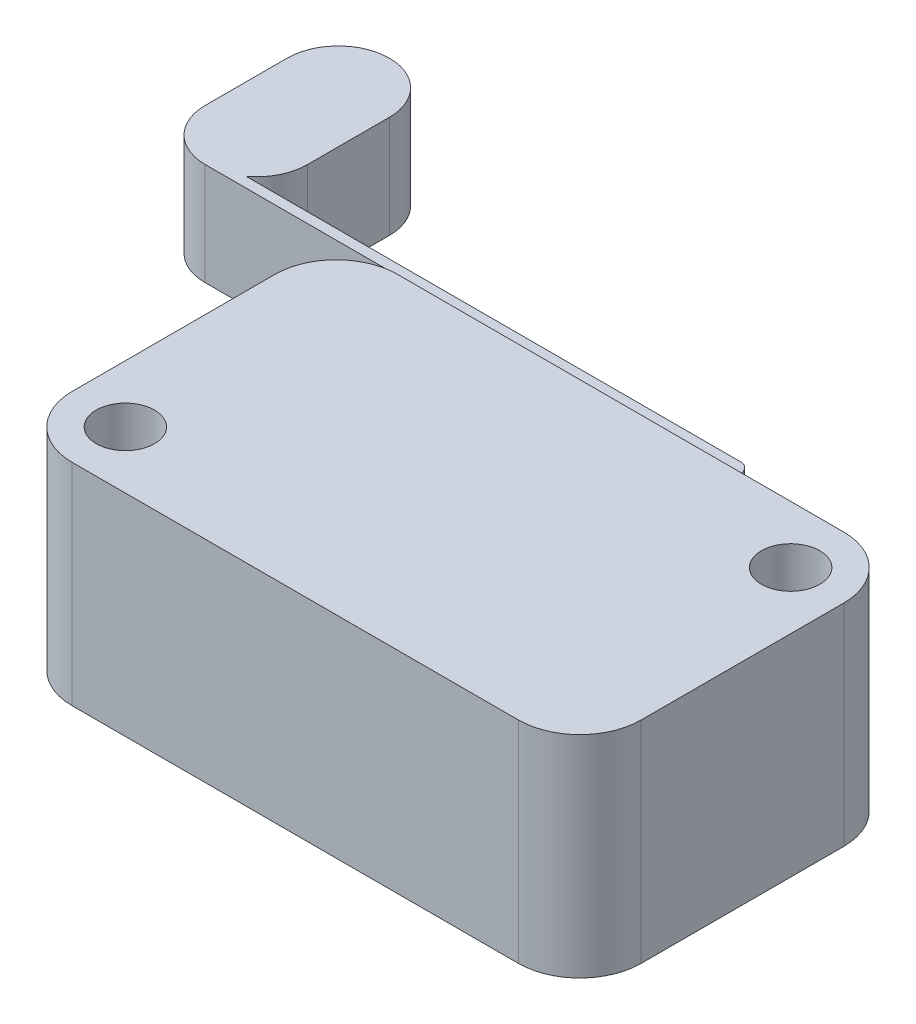
ISO-10303-21;
HEADER;
FILE_DESCRIPTION(('STEP AP214'),'2;1');
FILE_NAME('part.step','',(''),(''),'','','');
FILE_SCHEMA(('AUTOMOTIVE_DESIGN { 1 0 10303 214 1 1 1 1 }'));
ENDSEC;
DATA;
#1=APPLICATION_CONTEXT('core data for automotive mechanical design processes');
#2=APPLICATION_PROTOCOL_DEFINITION('international standard','automotive_design',2000,#1);
#3=PRODUCT_CONTEXT('',#1,'mechanical');
#4=PRODUCT('Part','Part','',(#3));
#5=PRODUCT_RELATED_PRODUCT_CATEGORY('part','',(#4));
#6=PRODUCT_DEFINITION_FORMATION('','',#4);
#7=PRODUCT_DEFINITION_CONTEXT('part definition',#1,'design');
#8=PRODUCT_DEFINITION('design','',#6,#7);
#9=PRODUCT_DEFINITION_SHAPE('','',#8);
#10=(LENGTH_UNIT() NAMED_UNIT(*) SI_UNIT(.MILLI.,.METRE.));
#11=(NAMED_UNIT(*) PLANE_ANGLE_UNIT() SI_UNIT($,.RADIAN.));
#12=(NAMED_UNIT(*) SI_UNIT($,.STERADIAN.) SOLID_ANGLE_UNIT());
#13=UNCERTAINTY_MEASURE_WITH_UNIT(LENGTH_MEASURE(1.E-05),#10,'distance_accuracy_value','');
#14=(GEOMETRIC_REPRESENTATION_CONTEXT(3) GLOBAL_UNCERTAINTY_ASSIGNED_CONTEXT((#13)) GLOBAL_UNIT_ASSIGNED_CONTEXT((#10,
#11,#12)) REPRESENTATION_CONTEXT('',''));
#15=CARTESIAN_POINT('',(0.,0.,0.));
#16=DIRECTION('',(0.,0.,1.));
#17=DIRECTION('',(1.,0.,0.));
#18=AXIS2_PLACEMENT_3D('',#15,#16,#17);
#19=CARTESIAN_POINT('',(0.,5.15,-2.8));
#20=DIRECTION('',(0.,0.,-1.));
#21=DIRECTION('',(-1.,0.,0.));
#22=AXIS2_PLACEMENT_3D('',#19,#20,#21);
#23=PLANE('',#22);
#24=DIRECTION('',(1.,0.,0.));
#25=VECTOR('',#24,1.);
#26=CARTESIAN_POINT('',(0.,2.5,-2.8));
#27=LINE('',#26,#25);
#28=CARTESIAN_POINT('',(-8.35,2.5,-2.8));
#29=VERTEX_POINT('',#28);
#30=CARTESIAN_POINT('',(-7.85,2.5,-2.8));
#31=VERTEX_POINT('',#30);
#32=EDGE_CURVE('E308',#29,#31,#27,.T.);
#33=ORIENTED_EDGE('',*,*,#32,.F.);
#34=DIRECTION('',(0.,-1.,0.));
#35=VECTOR('',#34,1.);
#36=CARTESIAN_POINT('',(-8.35,2.5,-2.8));
#37=LINE('',#36,#35);
#38=CARTESIAN_POINT('',(-8.35,-2.5,-2.8));
#39=VERTEX_POINT('',#38);
#40=EDGE_CURVE('E306',#29,#39,#37,.T.);
#41=ORIENTED_EDGE('',*,*,#40,.T.);
#42=DIRECTION('',(1.,0.,0.));
#43=VECTOR('',#42,1.);
#44=CARTESIAN_POINT('',(0.,-2.5,-2.8));
#45=LINE('',#44,#43);
#46=CARTESIAN_POINT('',(-7.85,-2.5,-2.8));
#47=VERTEX_POINT('',#46);
#48=EDGE_CURVE('E330',#39,#47,#45,.T.);
#49=ORIENTED_EDGE('',*,*,#48,.T.);
#50=DIRECTION('',(0.,-1.,0.));
#51=VECTOR('',#50,1.);
#52=CARTESIAN_POINT('',(-7.85,2.5,-2.8));
#53=LINE('',#52,#51);
#54=EDGE_CURVE('E317',#31,#47,#53,.T.);
#55=ORIENTED_EDGE('',*,*,#54,.F.);
#56=EDGE_LOOP('',(#33,#41,#49,#55));
#57=FACE_BOUND('',#56,.T.);
#58=DIRECTION('',(1.,0.,0.));
#59=VECTOR('',#58,1.);
#60=CARTESIAN_POINT('',(0.,5.15,-2.8));
#61=LINE('',#60,#59);
#62=CARTESIAN_POINT('',(-22.,5.15,-2.8));
#63=VERTEX_POINT('',#62);
#64=CARTESIAN_POINT('',(-0.199999999999996,5.15,-2.8));
#65=VERTEX_POINT('',#64);
#66=EDGE_CURVE('E215',#63,#65,#61,.T.);
#67=ORIENTED_EDGE('',*,*,#66,.T.);
#68=DIRECTION('',(0.,-1.,0.));
#69=VECTOR('',#68,1.);
#70=CARTESIAN_POINT('',(-0.199999999999996,5.15,-2.8));
#71=LINE('',#70,#69);
#72=CARTESIAN_POINT('',(-0.199999999999996,-5.15,-2.8));
#73=VERTEX_POINT('',#72);
#74=EDGE_CURVE('E242',#65,#73,#71,.T.);
#75=ORIENTED_EDGE('',*,*,#74,.T.);
#76=DIRECTION('',(1.,0.,0.));
#77=VECTOR('',#76,1.);
#78=CARTESIAN_POINT('',(0.,-5.15,-2.8));
#79=LINE('',#78,#77);
#80=CARTESIAN_POINT('',(-22.,-5.15,-2.8));
#81=VERTEX_POINT('',#80);
#82=EDGE_CURVE('E230',#81,#73,#79,.T.);
#83=ORIENTED_EDGE('',*,*,#82,.F.);
#84=DIRECTION('',(0.,-1.,0.));
#85=VECTOR('',#84,1.);
#86=CARTESIAN_POINT('',(-22.,5.15,-2.8));
#87=LINE('',#86,#85);
#88=EDGE_CURVE('E226',#81,#63,#87,.F.);
#89=ORIENTED_EDGE('',*,*,#88,.T.);
#90=EDGE_LOOP('',(#67,#75,#83,#89));
#91=FACE_BOUND('',#90,.T.);
#92=ADVANCED_FACE('F36',(#57,#91),#23,.T.);
#93=CARTESIAN_POINT('',(-25.,5.15,0.));
#94=DIRECTION('',(1.,0.,0.));
#95=DIRECTION('',(0.,0.,-1.));
#96=AXIS2_PLACEMENT_3D('',#93,#94,#95);
#97=PLANE('',#96);
#98=DIRECTION('',(0.,0.,1.));
#99=VECTOR('',#98,1.);
#100=CARTESIAN_POINT('',(-25.,5.15,0.));
#101=LINE('',#100,#99);
#102=CARTESIAN_POINT('',(-25.,5.15,0.200000000000001));
#103=VERTEX_POINT('',#102);
#104=CARTESIAN_POINT('',(-25.,5.15,10.1));
#105=VERTEX_POINT('',#104);
#106=EDGE_CURVE('E218',#103,#105,#101,.T.);
#107=ORIENTED_EDGE('',*,*,#106,.F.);
#108=DIRECTION('',(0.,-1.,0.));
#109=VECTOR('',#108,1.);
#110=CARTESIAN_POINT('',(-25.,-5.15,0.200000000000001));
#111=LINE('',#110,#109);
#112=CARTESIAN_POINT('',(-25.,-5.15,0.200000000000001));
#113=VERTEX_POINT('',#112);
#114=EDGE_CURVE('E273',#103,#113,#111,.T.);
#115=ORIENTED_EDGE('',*,*,#114,.T.);
#116=DIRECTION('',(0.,0.,1.));
#117=VECTOR('',#116,1.);
#118=CARTESIAN_POINT('',(-25.,-5.15,0.));
#119=LINE('',#118,#117);
#120=CARTESIAN_POINT('',(-25.,-5.15,10.1));
#121=VERTEX_POINT('',#120);
#122=EDGE_CURVE('E233',#113,#121,#119,.T.);
#123=ORIENTED_EDGE('',*,*,#122,.T.);
#124=DIRECTION('',(0.,-1.,0.));
#125=VECTOR('',#124,1.);
#126=CARTESIAN_POINT('',(-25.,5.15,10.1));
#127=LINE('',#126,#125);
#128=EDGE_CURVE('E271',#121,#105,#127,.F.);
#129=ORIENTED_EDGE('',*,*,#128,.T.);
#130=EDGE_LOOP('',(#107,#115,#123,#129));
#131=FACE_BOUND('',#130,.T.);
#132=ADVANCED_FACE('F374',(#131),#97,.F.);
#133=CARTESIAN_POINT('',(0.,5.15,13.1));
#134=DIRECTION('',(0.,0.,-1.));
#135=DIRECTION('',(-1.,0.,0.));
#136=AXIS2_PLACEMENT_3D('',#133,#134,#135);
#137=PLANE('',#136);
#138=DIRECTION('',(1.,0.,0.));
#139=VECTOR('',#138,1.);
#140=CARTESIAN_POINT('',(0.,-5.15,13.1));
#141=LINE('',#140,#139);
#142=CARTESIAN_POINT('',(-22.,-5.15,13.1));
#143=VERTEX_POINT('',#142);
#144=CARTESIAN_POINT('',(-0.199999999999996,-5.15,13.1));
#145=VERTEX_POINT('',#144);
#146=EDGE_CURVE('E236',#143,#145,#141,.T.);
#147=ORIENTED_EDGE('',*,*,#146,.T.);
#148=DIRECTION('',(0.,-1.,0.));
#149=VECTOR('',#148,1.);
#150=CARTESIAN_POINT('',(-0.199999999999996,5.15,13.1));
#151=LINE('',#150,#149);
#152=CARTESIAN_POINT('',(-0.199999999999996,5.15,13.1));
#153=VERTEX_POINT('',#152);
#154=EDGE_CURVE('E269',#145,#153,#151,.F.);
#155=ORIENTED_EDGE('',*,*,#154,.T.);
#156=DIRECTION('',(1.,0.,0.));
#157=VECTOR('',#156,1.);
#158=CARTESIAN_POINT('',(0.,5.15,13.1));
#159=LINE('',#158,#157);
#160=CARTESIAN_POINT('',(-22.,5.15,13.1));
#161=VERTEX_POINT('',#160);
#162=EDGE_CURVE('E221',#161,#153,#159,.T.);
#163=ORIENTED_EDGE('',*,*,#162,.F.);
#164=DIRECTION('',(0.,-1.,0.));
#165=VECTOR('',#164,1.);
#166=CARTESIAN_POINT('',(-22.,5.15,13.1));
#167=LINE('',#166,#165);
#168=EDGE_CURVE('E266',#161,#143,#167,.T.);
#169=ORIENTED_EDGE('',*,*,#168,.T.);
#170=EDGE_LOOP('',(#147,#155,#163,#169));
#171=FACE_BOUND('',#170,.T.);
#172=ADVANCED_FACE('F380',(#171),#137,.F.);
#173=CARTESIAN_POINT('',(0.,5.15,0.));
#174=DIRECTION('',(0.,-1.,0.));
#175=DIRECTION('',(0.,0.,-1.));
#176=AXIS2_PLACEMENT_3D('',#173,#174,#175);
#177=CYLINDRICAL_SURFACE('',#176,1.425);
#178=CARTESIAN_POINT('',(0.,5.15,0.));
#179=DIRECTION('',(0.,1.,0.));
#180=DIRECTION('',(0.,0.,1.));
#181=AXIS2_PLACEMENT_3D('',#178,#179,#180);
#182=CIRCLE('',#181,1.425);
#183=CARTESIAN_POINT('',(0.,5.15,-1.425));
#184=VERTEX_POINT('',#183);
#185=EDGE_CURVE('E211',#184,#184,#182,.T.);
#186=CARTESIAN_POINT('',(0.,-5.15,0.));
#187=DIRECTION('',(0.,1.,0.));
#188=DIRECTION('',(0.,0.,1.));
#189=AXIS2_PLACEMENT_3D('',#186,#187,#188);
#190=CIRCLE('',#189,1.425);
#191=CARTESIAN_POINT('',(0.,-5.15,-1.425));
#192=VERTEX_POINT('',#191);
#193=EDGE_CURVE('E202',#192,#192,#190,.T.);
#194=CARTESIAN_POINT('',(0.,5.15,-1.425));
#195=CARTESIAN_POINT('',(0.,5.04270833333333,-1.425));
#196=CARTESIAN_POINT('',(0.,4.93541666666667,-1.425));
#197=CARTESIAN_POINT('',(0.,4.72083333333333,-1.425));
#198=CARTESIAN_POINT('',(0.,4.61354166666667,-1.425));
#199=CARTESIAN_POINT('',(0.,4.39895833333333,-1.425));
#200=CARTESIAN_POINT('',(0.,4.29166666666667,-1.425));
#201=CARTESIAN_POINT('',(0.,4.07708333333333,-1.425));
#202=CARTESIAN_POINT('',(0.,3.96979166666667,-1.425));
#203=CARTESIAN_POINT('',(0.,3.75520833333333,-1.425));
#204=CARTESIAN_POINT('',(0.,3.64791666666667,-1.425));
#205=CARTESIAN_POINT('',(0.,3.43333333333333,-1.425));
#206=CARTESIAN_POINT('',(0.,3.32604166666667,-1.425));
#207=CARTESIAN_POINT('',(0.,3.11145833333333,-1.425));
#208=CARTESIAN_POINT('',(0.,3.00416666666667,-1.425));
#209=CARTESIAN_POINT('',(0.,2.78958333333333,-1.425));
#210=CARTESIAN_POINT('',(0.,2.68229166666667,-1.425));
#211=CARTESIAN_POINT('',(0.,2.46770833333333,-1.425));
#212=CARTESIAN_POINT('',(0.,2.36041666666667,-1.425));
#213=CARTESIAN_POINT('',(0.,2.14583333333333,-1.425));
#214=CARTESIAN_POINT('',(0.,2.03854166666667,-1.425));
#215=CARTESIAN_POINT('',(0.,1.82395833333333,-1.425));
#216=CARTESIAN_POINT('',(0.,1.71666666666667,-1.425));
#217=CARTESIAN_POINT('',(0.,1.50208333333333,-1.425));
#218=CARTESIAN_POINT('',(0.,1.39479166666667,-1.425));
#219=CARTESIAN_POINT('',(0.,1.18020833333333,-1.425));
#220=CARTESIAN_POINT('',(0.,1.07291666666667,-1.425));
#221=CARTESIAN_POINT('',(0.,0.858333333333332,-1.425));
#222=CARTESIAN_POINT('',(0.,0.751041666666665,-1.425));
#223=CARTESIAN_POINT('',(0.,0.536458333333332,-1.425));
#224=CARTESIAN_POINT('',(0.,0.429166666666665,-1.425));
#225=CARTESIAN_POINT('',(0.,0.214583333333332,-1.425));
#226=CARTESIAN_POINT('',(0.,0.107291666666665,-1.425));
#227=CARTESIAN_POINT('',(0.,-0.107291666666668,-1.425));
#228=CARTESIAN_POINT('',(0.,-0.214583333333335,-1.425));
#229=CARTESIAN_POINT('',(0.,-0.429166666666669,-1.425));
#230=CARTESIAN_POINT('',(0.,-0.536458333333335,-1.425));
#231=CARTESIAN_POINT('',(0.,-0.751041666666669,-1.425));
#232=CARTESIAN_POINT('',(0.,-0.858333333333335,-1.425));
#233=CARTESIAN_POINT('',(0.,-1.07291666666667,-1.425));
#234=CARTESIAN_POINT('',(0.,-1.18020833333334,-1.425));
#235=CARTESIAN_POINT('',(0.,-1.39479166666667,-1.425));
#236=CARTESIAN_POINT('',(0.,-1.50208333333334,-1.425));
#237=CARTESIAN_POINT('',(0.,-1.71666666666667,-1.425));
#238=CARTESIAN_POINT('',(0.,-1.82395833333334,-1.425));
#239=CARTESIAN_POINT('',(0.,-2.03854166666667,-1.425));
#240=CARTESIAN_POINT('',(0.,-2.14583333333334,-1.425));
#241=CARTESIAN_POINT('',(0.,-2.36041666666667,-1.425));
#242=CARTESIAN_POINT('',(0.,-2.46770833333334,-1.425));
#243=CARTESIAN_POINT('',(0.,-2.68229166666667,-1.425));
#244=CARTESIAN_POINT('',(0.,-2.78958333333333,-1.425));
#245=CARTESIAN_POINT('',(0.,-3.00416666666667,-1.425));
#246=CARTESIAN_POINT('',(0.,-3.11145833333333,-1.425));
#247=CARTESIAN_POINT('',(0.,-3.32604166666667,-1.425));
#248=CARTESIAN_POINT('',(0.,-3.43333333333333,-1.425));
#249=CARTESIAN_POINT('',(0.,-3.64791666666667,-1.425));
#250=CARTESIAN_POINT('',(0.,-3.75520833333333,-1.425));
#251=CARTESIAN_POINT('',(0.,-3.96979166666667,-1.425));
#252=CARTESIAN_POINT('',(0.,-4.07708333333333,-1.425));
#253=CARTESIAN_POINT('',(0.,-4.29166666666667,-1.425));
#254=CARTESIAN_POINT('',(0.,-4.39895833333333,-1.425));
#255=CARTESIAN_POINT('',(0.,-4.61354166666667,-1.425));
#256=CARTESIAN_POINT('',(0.,-4.72083333333334,-1.425));
#257=CARTESIAN_POINT('',(0.,-4.93541666666667,-1.425));
#258=CARTESIAN_POINT('',(0.,-5.04270833333334,-1.425));
#259=CARTESIAN_POINT('',(0.,-5.15,-1.425));
#260=B_SPLINE_CURVE_WITH_KNOTS('',3,(#194,#195,#196,#197,#198,#199,#200,#201,#202,#203,#204,
#205,#206,#207,#208,#209,#210,#211,#212,#213,#214,#215,#216,#217,#218,#219,#220,#221,#222,#223,
#224,#225,#226,#227,#228,#229,#230,#231,#232,#233,#234,#235,#236,#237,#238,#239,#240,#241,#242,
#243,#244,#245,#246,#247,#248,#249,#250,#251,#252,#253,#254,#255,#256,#257,#258,#259),
.UNSPECIFIED.,.F.,.F.,(4,2,2,2,2,2,2,2,2,2,2,2,2,2,2,2,2,2,2,2,2,2,2,2,2,2,2,2,2,2,2,2,4),(0.,
0.321874999999999,0.643749999999999,0.965625,1.2875,1.609375,1.93125,2.253125,2.575,2.896875,
3.21875,3.540625,3.8625,4.184375,4.50625,4.828125,5.15,5.471875,5.79375,6.115625,6.4375,
6.759375,7.08125,7.403125,7.725,8.046875,8.36875,8.690625,9.0125,9.334375,9.65625,9.978125,
10.3),.UNSPECIFIED.);
#261=EDGE_CURVE('BSEAM386',#184,#192,#260,.T.);
#262=ORIENTED_EDGE('',*,*,#185,.T.);
#263=ORIENTED_EDGE('',*,*,#193,.F.);
#264=ORIENTED_EDGE('',*,*,#261,.T.);
#265=ORIENTED_EDGE('',*,*,#261,.F.);
#266=EDGE_LOOP('',(#262,#264,#263,#265));
#267=FACE_BOUND('',#266,.T.);
#268=ADVANCED_FACE('F386',(#267),#177,.F.);
#269=CARTESIAN_POINT('',(-22.2,5.15,10.3));
#270=DIRECTION('',(0.,-1.,0.));
#271=DIRECTION('',(0.,0.,-1.));
#272=AXIS2_PLACEMENT_3D('',#269,#270,#271);
#273=CYLINDRICAL_SURFACE('',#272,1.425);
#274=CARTESIAN_POINT('',(-22.2,5.15,10.3));
#275=DIRECTION('',(0.,1.,0.));
#276=DIRECTION('',(0.,0.,1.));
#277=AXIS2_PLACEMENT_3D('',#274,#275,#276);
#278=CIRCLE('',#277,1.425);
#279=CARTESIAN_POINT('',(-22.2,5.15,8.875));
#280=VERTEX_POINT('',#279);
#281=EDGE_CURVE('E208',#280,#280,#278,.T.);
#282=CARTESIAN_POINT('',(-22.2,-5.15,10.3));
#283=DIRECTION('',(0.,1.,0.));
#284=DIRECTION('',(0.,0.,1.));
#285=AXIS2_PLACEMENT_3D('',#282,#283,#284);
#286=CIRCLE('',#285,1.425);
#287=CARTESIAN_POINT('',(-22.2,-5.15,8.875));
#288=VERTEX_POINT('',#287);
#289=EDGE_CURVE('E199',#288,#288,#286,.T.);
#290=CARTESIAN_POINT('',(-22.2,5.15,8.875));
#291=CARTESIAN_POINT('',(-22.2,5.04270833333333,8.875));
#292=CARTESIAN_POINT('',(-22.2,4.93541666666667,8.875));
#293=CARTESIAN_POINT('',(-22.2,4.72083333333333,8.875));
#294=CARTESIAN_POINT('',(-22.2,4.61354166666667,8.875));
#295=CARTESIAN_POINT('',(-22.2,4.39895833333333,8.875));
#296=CARTESIAN_POINT('',(-22.2,4.29166666666667,8.875));
#297=CARTESIAN_POINT('',(-22.2,4.07708333333333,8.875));
#298=CARTESIAN_POINT('',(-22.2,3.96979166666667,8.875));
#299=CARTESIAN_POINT('',(-22.2,3.75520833333333,8.875));
#300=CARTESIAN_POINT('',(-22.2,3.64791666666667,8.875));
#301=CARTESIAN_POINT('',(-22.2,3.43333333333333,8.875));
#302=CARTESIAN_POINT('',(-22.2,3.32604166666667,8.875));
#303=CARTESIAN_POINT('',(-22.2,3.11145833333333,8.875));
#304=CARTESIAN_POINT('',(-22.2,3.00416666666667,8.875));
#305=CARTESIAN_POINT('',(-22.2,2.78958333333333,8.875));
#306=CARTESIAN_POINT('',(-22.2,2.68229166666667,8.875));
#307=CARTESIAN_POINT('',(-22.2,2.46770833333333,8.875));
#308=CARTESIAN_POINT('',(-22.2,2.36041666666667,8.875));
#309=CARTESIAN_POINT('',(-22.2,2.14583333333333,8.875));
#310=CARTESIAN_POINT('',(-22.2,2.03854166666667,8.875));
#311=CARTESIAN_POINT('',(-22.2,1.82395833333333,8.875));
#312=CARTESIAN_POINT('',(-22.2,1.71666666666667,8.875));
#313=CARTESIAN_POINT('',(-22.2,1.50208333333333,8.875));
#314=CARTESIAN_POINT('',(-22.2,1.39479166666667,8.875));
#315=CARTESIAN_POINT('',(-22.2,1.18020833333333,8.875));
#316=CARTESIAN_POINT('',(-22.2,1.07291666666667,8.875));
#317=CARTESIAN_POINT('',(-22.2,0.858333333333332,8.875));
#318=CARTESIAN_POINT('',(-22.2,0.751041666666665,8.875));
#319=CARTESIAN_POINT('',(-22.2,0.536458333333332,8.875));
#320=CARTESIAN_POINT('',(-22.2,0.429166666666665,8.875));
#321=CARTESIAN_POINT('',(-22.2,0.214583333333332,8.875));
#322=CARTESIAN_POINT('',(-22.2,0.107291666666665,8.875));
#323=CARTESIAN_POINT('',(-22.2,-0.107291666666668,8.875));
#324=CARTESIAN_POINT('',(-22.2,-0.214583333333335,8.875));
#325=CARTESIAN_POINT('',(-22.2,-0.429166666666669,8.875));
#326=CARTESIAN_POINT('',(-22.2,-0.536458333333335,8.875));
#327=CARTESIAN_POINT('',(-22.2,-0.751041666666669,8.875));
#328=CARTESIAN_POINT('',(-22.2,-0.858333333333335,8.875));
#329=CARTESIAN_POINT('',(-22.2,-1.07291666666667,8.875));
#330=CARTESIAN_POINT('',(-22.2,-1.18020833333334,8.875));
#331=CARTESIAN_POINT('',(-22.2,-1.39479166666667,8.875));
#332=CARTESIAN_POINT('',(-22.2,-1.50208333333334,8.875));
#333=CARTESIAN_POINT('',(-22.2,-1.71666666666667,8.875));
#334=CARTESIAN_POINT('',(-22.2,-1.82395833333334,8.875));
#335=CARTESIAN_POINT('',(-22.2,-2.03854166666667,8.875));
#336=CARTESIAN_POINT('',(-22.2,-2.14583333333334,8.875));
#337=CARTESIAN_POINT('',(-22.2,-2.36041666666667,8.875));
#338=CARTESIAN_POINT('',(-22.2,-2.46770833333334,8.875));
#339=CARTESIAN_POINT('',(-22.2,-2.68229166666667,8.875));
#340=CARTESIAN_POINT('',(-22.2,-2.78958333333333,8.875));
#341=CARTESIAN_POINT('',(-22.2,-3.00416666666667,8.875));
#342=CARTESIAN_POINT('',(-22.2,-3.11145833333333,8.875));
#343=CARTESIAN_POINT('',(-22.2,-3.32604166666667,8.875));
#344=CARTESIAN_POINT('',(-22.2,-3.43333333333333,8.875));
#345=CARTESIAN_POINT('',(-22.2,-3.64791666666667,8.875));
#346=CARTESIAN_POINT('',(-22.2,-3.75520833333333,8.875));
#347=CARTESIAN_POINT('',(-22.2,-3.96979166666667,8.875));
#348=CARTESIAN_POINT('',(-22.2,-4.07708333333333,8.875));
#349=CARTESIAN_POINT('',(-22.2,-4.29166666666667,8.875));
#350=CARTESIAN_POINT('',(-22.2,-4.39895833333333,8.875));
#351=CARTESIAN_POINT('',(-22.2,-4.61354166666667,8.875));
#352=CARTESIAN_POINT('',(-22.2,-4.72083333333334,8.875));
#353=CARTESIAN_POINT('',(-22.2,-4.93541666666667,8.875));
#354=CARTESIAN_POINT('',(-22.2,-5.04270833333334,8.875));
#355=CARTESIAN_POINT('',(-22.2,-5.15,8.875));
#356=B_SPLINE_CURVE_WITH_KNOTS('',3,(#290,#291,#292,#293,#294,#295,#296,#297,#298,#299,#300,
#301,#302,#303,#304,#305,#306,#307,#308,#309,#310,#311,#312,#313,#314,#315,#316,#317,#318,#319,
#320,#321,#322,#323,#324,#325,#326,#327,#328,#329,#330,#331,#332,#333,#334,#335,#336,#337,#338,
#339,#340,#341,#342,#343,#344,#345,#346,#347,#348,#349,#350,#351,#352,#353,#354,#355),
.UNSPECIFIED.,.F.,.F.,(4,2,2,2,2,2,2,2,2,2,2,2,2,2,2,2,2,2,2,2,2,2,2,2,2,2,2,2,2,2,2,2,4),(0.,
0.321874999999999,0.643749999999999,0.965625,1.2875,1.609375,1.93125,2.253125,2.575,2.896875,
3.21875,3.540625,3.8625,4.184375,4.50625,4.828125,5.15,5.471875,5.79375,6.115625,6.4375,
6.759375,7.08125,7.403125,7.725,8.046875,8.36875,8.690625,9.0125,9.334375,9.65625,9.978125,
10.3),.UNSPECIFIED.);
#357=EDGE_CURVE('BSEAM389',#280,#288,#356,.T.);
#358=ORIENTED_EDGE('',*,*,#281,.T.);
#359=ORIENTED_EDGE('',*,*,#289,.F.);
#360=ORIENTED_EDGE('',*,*,#357,.T.);
#361=ORIENTED_EDGE('',*,*,#357,.F.);
#362=EDGE_LOOP('',(#358,#360,#359,#361));
#363=FACE_BOUND('',#362,.T.);
#364=ADVANCED_FACE('F389',(#363),#273,.F.);
#365=CARTESIAN_POINT('',(2.8,5.15,0.));
#366=DIRECTION('',(1.,0.,0.));
#367=DIRECTION('',(0.,0.,-1.));
#368=AXIS2_PLACEMENT_3D('',#365,#366,#367);
#369=PLANE('',#368);
#370=DIRECTION('',(0.,0.,1.));
#371=VECTOR('',#370,1.);
#372=CARTESIAN_POINT('',(2.8,-5.15,0.));
#373=LINE('',#372,#371);
#374=CARTESIAN_POINT('',(2.8,-5.15,0.199999999999999));
#375=VERTEX_POINT('',#374);
#376=CARTESIAN_POINT('',(2.8,-5.15,10.1));
#377=VERTEX_POINT('',#376);
#378=EDGE_CURVE('E212',#375,#377,#373,.T.);
#379=ORIENTED_EDGE('',*,*,#378,.F.);
#380=DIRECTION('',(0.,-1.,0.));
#381=VECTOR('',#380,1.);
#382=CARTESIAN_POINT('',(2.8,5.15,0.199999999999999));
#383=LINE('',#382,#381);
#384=CARTESIAN_POINT('',(2.8,5.15,0.199999999999999));
#385=VERTEX_POINT('',#384);
#386=EDGE_CURVE('E256',#375,#385,#383,.F.);
#387=ORIENTED_EDGE('',*,*,#386,.T.);
#388=DIRECTION('',(0.,0.,1.));
#389=VECTOR('',#388,1.);
#390=CARTESIAN_POINT('',(2.8,5.15,0.));
#391=LINE('',#390,#389);
#392=CARTESIAN_POINT('',(2.8,5.15,10.1));
#393=VERTEX_POINT('',#392);
#394=EDGE_CURVE('E224',#385,#393,#391,.T.);
#395=ORIENTED_EDGE('',*,*,#394,.T.);
#396=DIRECTION('',(0.,-1.,0.));
#397=VECTOR('',#396,1.);
#398=CARTESIAN_POINT('',(2.8,-5.15,10.1));
#399=LINE('',#398,#397);
#400=EDGE_CURVE('E253',#393,#377,#399,.T.);
#401=ORIENTED_EDGE('',*,*,#400,.T.);
#402=EDGE_LOOP('',(#379,#387,#395,#401));
#403=FACE_BOUND('',#402,.T.);
#404=ADVANCED_FACE('F393',(#403),#369,.T.);
#405=CARTESIAN_POINT('',(0.,5.15,0.));
#406=DIRECTION('',(0.,1.,0.));
#407=DIRECTION('',(0.,0.,1.));
#408=AXIS2_PLACEMENT_3D('',#405,#406,#407);
#409=PLANE('',#408);
#410=ORIENTED_EDGE('',*,*,#281,.F.);
#411=EDGE_LOOP('',(#410));
#412=FACE_BOUND('',#411,.T.);
#413=ORIENTED_EDGE('',*,*,#185,.F.);
#414=EDGE_LOOP('',(#413));
#415=FACE_BOUND('',#414,.T.);
#416=ORIENTED_EDGE('',*,*,#394,.F.);
#417=CARTESIAN_POINT('',(-0.199999999999996,5.15,0.199999999999999));
#418=DIRECTION('',(0.,1.,0.));
#419=DIRECTION('',(0.,0.,1.));
#420=AXIS2_PLACEMENT_3D('',#417,#418,#419);
#421=CIRCLE('',#420,3.);
#422=EDGE_CURVE('E264',#385,#65,#421,.T.);
#423=ORIENTED_EDGE('',*,*,#422,.T.);
#424=ORIENTED_EDGE('',*,*,#66,.F.);
#425=CARTESIAN_POINT('',(-22.,5.15,0.200000000000001));
#426=DIRECTION('',(0.,1.,0.));
#427=DIRECTION('',(0.,0.,1.));
#428=AXIS2_PLACEMENT_3D('',#425,#426,#427);
#429=CIRCLE('',#428,3.);
#430=EDGE_CURVE('E260',#63,#103,#429,.T.);
#431=ORIENTED_EDGE('',*,*,#430,.T.);
#432=ORIENTED_EDGE('',*,*,#106,.T.);
#433=CARTESIAN_POINT('',(-22.,5.15,10.1));
#434=DIRECTION('',(0.,1.,0.));
#435=DIRECTION('',(0.,0.,1.));
#436=AXIS2_PLACEMENT_3D('',#433,#434,#435);
#437=CIRCLE('',#436,3.);
#438=EDGE_CURVE('E258',#105,#161,#437,.T.);
#439=ORIENTED_EDGE('',*,*,#438,.T.);
#440=ORIENTED_EDGE('',*,*,#162,.T.);
#441=CARTESIAN_POINT('',(-0.199999999999996,5.15,10.1));
#442=DIRECTION('',(0.,1.,0.));
#443=DIRECTION('',(0.,0.,1.));
#444=AXIS2_PLACEMENT_3D('',#441,#442,#443);
#445=CIRCLE('',#444,3.);
#446=EDGE_CURVE('E262',#153,#393,#445,.T.);
#447=ORIENTED_EDGE('',*,*,#446,.T.);
#448=EDGE_LOOP('',(#416,#423,#424,#431,#432,#439,#440,#447));
#449=FACE_BOUND('',#448,.T.);
#450=ADVANCED_FACE('F560',(#412,#415,#449),#409,.T.);
#451=CARTESIAN_POINT('',(0.,-5.15,0.));
#452=DIRECTION('',(0.,1.,0.));
#453=DIRECTION('',(0.,0.,1.));
#454=AXIS2_PLACEMENT_3D('',#451,#452,#453);
#455=PLANE('',#454);
#456=ORIENTED_EDGE('',*,*,#289,.T.);
#457=EDGE_LOOP('',(#456));
#458=FACE_BOUND('',#457,.T.);
#459=ORIENTED_EDGE('',*,*,#193,.T.);
#460=EDGE_LOOP('',(#459));
#461=FACE_BOUND('',#460,.T.);
#462=ORIENTED_EDGE('',*,*,#82,.T.);
#463=CARTESIAN_POINT('',(-0.199999999999996,-5.15,0.199999999999999));
#464=DIRECTION('',(0.,1.,0.));
#465=DIRECTION('',(0.,0.,1.));
#466=AXIS2_PLACEMENT_3D('',#463,#464,#465);
#467=CIRCLE('',#466,3.);
#468=EDGE_CURVE('E251',#73,#375,#467,.F.);
#469=ORIENTED_EDGE('',*,*,#468,.T.);
#470=ORIENTED_EDGE('',*,*,#378,.T.);
#471=CARTESIAN_POINT('',(-0.199999999999996,-5.15,10.1));
#472=DIRECTION('',(0.,1.,0.));
#473=DIRECTION('',(0.,0.,1.));
#474=AXIS2_PLACEMENT_3D('',#471,#472,#473);
#475=CIRCLE('',#474,3.);
#476=EDGE_CURVE('E249',#377,#145,#475,.F.);
#477=ORIENTED_EDGE('',*,*,#476,.T.);
#478=ORIENTED_EDGE('',*,*,#146,.F.);
#479=CARTESIAN_POINT('',(-22.,-5.15,10.1));
#480=DIRECTION('',(0.,1.,0.));
#481=DIRECTION('',(0.,0.,1.));
#482=AXIS2_PLACEMENT_3D('',#479,#480,#481);
#483=CIRCLE('',#482,3.);
#484=EDGE_CURVE('E245',#143,#121,#483,.F.);
#485=ORIENTED_EDGE('',*,*,#484,.T.);
#486=ORIENTED_EDGE('',*,*,#122,.F.);
#487=CARTESIAN_POINT('',(-22.,-5.15,0.200000000000001));
#488=DIRECTION('',(0.,1.,0.));
#489=DIRECTION('',(0.,0.,1.));
#490=AXIS2_PLACEMENT_3D('',#487,#488,#489);
#491=CIRCLE('',#490,3.);
#492=EDGE_CURVE('E247',#113,#81,#491,.F.);
#493=ORIENTED_EDGE('',*,*,#492,.T.);
#494=EDGE_LOOP('',(#462,#469,#470,#477,#478,#485,#486,#493));
#495=FACE_BOUND('',#494,.T.);
#496=ADVANCED_FACE('F399',(#458,#461,#495),#455,.F.);
#497=CARTESIAN_POINT('',(-0.199999999999996,5.15,0.199999999999999));
#498=DIRECTION('',(0.,-1.,0.));
#499=DIRECTION('',(0.,0.,-1.));
#500=AXIS2_PLACEMENT_3D('',#497,#498,#499);
#501=CYLINDRICAL_SURFACE('',#500,3.);
#502=ORIENTED_EDGE('',*,*,#422,.F.);
#503=ORIENTED_EDGE('',*,*,#386,.F.);
#504=ORIENTED_EDGE('',*,*,#468,.F.);
#505=ORIENTED_EDGE('',*,*,#74,.F.);
#506=EDGE_LOOP('',(#502,#503,#504,#505));
#507=FACE_BOUND('',#506,.T.);
#508=ADVANCED_FACE('F395',(#507),#501,.T.);
#509=CARTESIAN_POINT('',(-0.199999999999996,5.15,10.1));
#510=DIRECTION('',(0.,1.,0.));
#511=DIRECTION('',(0.,0.,1.));
#512=AXIS2_PLACEMENT_3D('',#509,#510,#511);
#513=CYLINDRICAL_SURFACE('',#512,3.);
#514=ORIENTED_EDGE('',*,*,#446,.F.);
#515=ORIENTED_EDGE('',*,*,#154,.F.);
#516=ORIENTED_EDGE('',*,*,#476,.F.);
#517=ORIENTED_EDGE('',*,*,#400,.F.);
#518=EDGE_LOOP('',(#514,#515,#516,#517));
#519=FACE_BOUND('',#518,.T.);
#520=ADVANCED_FACE('F398',(#519),#513,.T.);
#521=CARTESIAN_POINT('',(-22.,5.15,0.200000000000001));
#522=DIRECTION('',(0.,1.,0.));
#523=DIRECTION('',(0.,0.,1.));
#524=AXIS2_PLACEMENT_3D('',#521,#522,#523);
#525=CYLINDRICAL_SURFACE('',#524,3.);
#526=ORIENTED_EDGE('',*,*,#430,.F.);
#527=ORIENTED_EDGE('',*,*,#88,.F.);
#528=ORIENTED_EDGE('',*,*,#492,.F.);
#529=ORIENTED_EDGE('',*,*,#114,.F.);
#530=EDGE_LOOP('',(#526,#527,#528,#529));
#531=FACE_BOUND('',#530,.T.);
#532=ADVANCED_FACE('F403',(#531),#525,.T.);
#533=CARTESIAN_POINT('',(-22.,5.15,10.1));
#534=DIRECTION('',(0.,-1.,0.));
#535=DIRECTION('',(0.,0.,-1.));
#536=AXIS2_PLACEMENT_3D('',#533,#534,#535);
#537=CYLINDRICAL_SURFACE('',#536,3.);
#538=ORIENTED_EDGE('',*,*,#438,.F.);
#539=ORIENTED_EDGE('',*,*,#128,.F.);
#540=ORIENTED_EDGE('',*,*,#484,.F.);
#541=ORIENTED_EDGE('',*,*,#168,.F.);
#542=EDGE_LOOP('',(#538,#539,#540,#541));
#543=FACE_BOUND('',#542,.T.);
#544=ADVANCED_FACE('F407',(#543),#537,.T.);
#545=CARTESIAN_POINT('',(0.,2.5,-5.9));
#546=DIRECTION('',(0.,0.,1.));
#547=DIRECTION('',(1.,0.,0.));
#548=AXIS2_PLACEMENT_3D('',#545,#546,#547);
#549=PLANE('',#548);
#550=DIRECTION('',(-1.,0.,0.));
#551=VECTOR('',#550,1.);
#552=CARTESIAN_POINT('',(0.,2.5,-5.9));
#553=LINE('',#552,#551);
#554=CARTESIAN_POINT('',(-8.35,2.5,-5.9));
#555=VERTEX_POINT('',#554);
#556=CARTESIAN_POINT('',(-32.5,2.5,-5.9));
#557=VERTEX_POINT('',#556);
#558=EDGE_CURVE('E171',#555,#557,#553,.T.);
#559=ORIENTED_EDGE('',*,*,#558,.F.);
#560=DIRECTION('',(0.,-1.,0.));
#561=VECTOR('',#560,1.);
#562=CARTESIAN_POINT('',(-8.35,2.5,-5.9));
#563=LINE('',#562,#561);
#564=CARTESIAN_POINT('',(-8.35,-2.5,-5.9));
#565=VERTEX_POINT('',#564);
#566=EDGE_CURVE('E276',#555,#565,#563,.T.);
#567=ORIENTED_EDGE('',*,*,#566,.T.);
#568=DIRECTION('',(-1.,0.,0.));
#569=VECTOR('',#568,1.);
#570=CARTESIAN_POINT('',(0.,-2.5,-5.9));
#571=LINE('',#570,#569);
#572=CARTESIAN_POINT('',(-32.5,-2.5,-5.9));
#573=VERTEX_POINT('',#572);
#574=EDGE_CURVE('E197',#565,#573,#571,.T.);
#575=ORIENTED_EDGE('',*,*,#574,.T.);
#576=DIRECTION('',(0.,-1.,0.));
#577=VECTOR('',#576,1.);
#578=CARTESIAN_POINT('',(-32.5,2.5,-5.9));
#579=LINE('',#578,#577);
#580=EDGE_CURVE('E188',#557,#573,#579,.T.);
#581=ORIENTED_EDGE('',*,*,#580,.F.);
#582=EDGE_LOOP('',(#559,#567,#575,#581));
#583=FACE_BOUND('',#582,.T.);
#584=ADVANCED_FACE('F195',(#583),#549,.F.);
#585=CARTESIAN_POINT('',(-34.,2.5,-7.9));
#586=DIRECTION('',(0.,-1.,0.));
#587=DIRECTION('',(0.,0.,-1.));
#588=AXIS2_PLACEMENT_3D('',#585,#586,#587);
#589=CYLINDRICAL_SURFACE('',#588,2.5);
#590=CARTESIAN_POINT('',(-34.,-2.5,-7.9));
#591=DIRECTION('',(0.,1.,0.));
#592=DIRECTION('',(0.,0.,1.));
#593=AXIS2_PLACEMENT_3D('',#590,#591,#592);
#594=CIRCLE('',#593,2.5);
#595=CARTESIAN_POINT('',(-31.5,-2.5,-7.9));
#596=VERTEX_POINT('',#595);
#597=EDGE_CURVE('E319',#573,#596,#594,.T.);
#598=ORIENTED_EDGE('',*,*,#597,.T.);
#599=DIRECTION('',(0.,-1.,0.));
#600=VECTOR('',#599,1.);
#601=CARTESIAN_POINT('',(-31.5,2.5,-7.9));
#602=LINE('',#601,#600);
#603=CARTESIAN_POINT('',(-31.5,2.5,-7.9));
#604=VERTEX_POINT('',#603);
#605=EDGE_CURVE('E190',#604,#596,#602,.T.);
#606=ORIENTED_EDGE('',*,*,#605,.F.);
#607=CARTESIAN_POINT('',(-34.,2.5,-7.9));
#608=DIRECTION('',(0.,1.,0.));
#609=DIRECTION('',(0.,0.,1.));
#610=AXIS2_PLACEMENT_3D('',#607,#608,#609);
#611=CIRCLE('',#610,2.5);
#612=EDGE_CURVE('E175',#557,#604,#611,.T.);
#613=ORIENTED_EDGE('',*,*,#612,.F.);
#614=ORIENTED_EDGE('',*,*,#580,.T.);
#615=EDGE_LOOP('',(#598,#606,#613,#614));
#616=FACE_BOUND('',#615,.T.);
#617=ADVANCED_FACE('F187',(#616),#589,.T.);
#618=CARTESIAN_POINT('',(-31.5,2.5,0.));
#619=DIRECTION('',(-1.,0.,0.));
#620=DIRECTION('',(0.,0.,1.));
#621=AXIS2_PLACEMENT_3D('',#618,#619,#620);
#622=PLANE('',#621);
#623=DIRECTION('',(0.,0.,-1.));
#624=VECTOR('',#623,1.);
#625=CARTESIAN_POINT('',(-31.5,-2.5,0.));
#626=LINE('',#625,#624);
#627=CARTESIAN_POINT('',(-31.5,-2.5,-11.9));
#628=VERTEX_POINT('',#627);
#629=EDGE_CURVE('E321',#596,#628,#626,.T.);
#630=ORIENTED_EDGE('',*,*,#629,.T.);
#631=DIRECTION('',(0.,-1.,0.));
#632=VECTOR('',#631,1.);
#633=CARTESIAN_POINT('',(-31.5,2.5,-11.9));
#634=LINE('',#633,#632);
#635=CARTESIAN_POINT('',(-31.5,2.5,-11.9));
#636=VERTEX_POINT('',#635);
#637=EDGE_CURVE('E204',#636,#628,#634,.T.);
#638=ORIENTED_EDGE('',*,*,#637,.F.);
#639=DIRECTION('',(0.,0.,-1.));
#640=VECTOR('',#639,1.);
#641=CARTESIAN_POINT('',(-31.5,2.5,0.));
#642=LINE('',#641,#640);
#643=EDGE_CURVE('E192',#604,#636,#642,.T.);
#644=ORIENTED_EDGE('',*,*,#643,.F.);
#645=ORIENTED_EDGE('',*,*,#605,.T.);
#646=EDGE_LOOP('',(#630,#638,#644,#645));
#647=FACE_BOUND('',#646,.T.);
#648=ADVANCED_FACE('F362',(#647),#622,.F.);
#649=CARTESIAN_POINT('',(-34.,2.5,-11.9));
#650=DIRECTION('',(0.,-1.,0.));
#651=DIRECTION('',(0.,0.,-1.));
#652=AXIS2_PLACEMENT_3D('',#649,#650,#651);
#653=CYLINDRICAL_SURFACE('',#652,2.5);
#654=CARTESIAN_POINT('',(-34.,-2.5,-11.9));
#655=DIRECTION('',(0.,1.,0.));
#656=DIRECTION('',(0.,0.,1.));
#657=AXIS2_PLACEMENT_3D('',#654,#655,#656);
#658=CIRCLE('',#657,2.5);
#659=CARTESIAN_POINT('',(-36.5,-2.5,-11.9));
#660=VERTEX_POINT('',#659);
#661=EDGE_CURVE('E323',#628,#660,#658,.T.);
#662=ORIENTED_EDGE('',*,*,#661,.T.);
#663=DIRECTION('',(0.,-1.,0.));
#664=VECTOR('',#663,1.);
#665=CARTESIAN_POINT('',(-36.5,2.5,-11.9));
#666=LINE('',#665,#664);
#667=CARTESIAN_POINT('',(-36.5,2.5,-11.9));
#668=VERTEX_POINT('',#667);
#669=EDGE_CURVE('E341',#668,#660,#666,.T.);
#670=ORIENTED_EDGE('',*,*,#669,.F.);
#671=CARTESIAN_POINT('',(-34.,2.5,-11.9));
#672=DIRECTION('',(0.,1.,0.));
#673=DIRECTION('',(0.,0.,1.));
#674=AXIS2_PLACEMENT_3D('',#671,#672,#673);
#675=CIRCLE('',#674,2.5);
#676=EDGE_CURVE('E349',#636,#668,#675,.T.);
#677=ORIENTED_EDGE('',*,*,#676,.F.);
#678=ORIENTED_EDGE('',*,*,#637,.T.);
#679=EDGE_LOOP('',(#662,#670,#677,#678));
#680=FACE_BOUND('',#679,.T.);
#681=ADVANCED_FACE('F347',(#680),#653,.T.);
#682=CARTESIAN_POINT('',(-36.5,2.5,0.));
#683=DIRECTION('',(-1.,0.,0.));
#684=DIRECTION('',(0.,0.,1.));
#685=AXIS2_PLACEMENT_3D('',#682,#683,#684);
#686=PLANE('',#685);
#687=DIRECTION('',(0.,0.,-1.));
#688=VECTOR('',#687,1.);
#689=CARTESIAN_POINT('',(-36.5,-2.5,0.));
#690=LINE('',#689,#688);
#691=CARTESIAN_POINT('',(-36.5,-2.5,-7.9));
#692=VERTEX_POINT('',#691);
#693=EDGE_CURVE('E326',#692,#660,#690,.T.);
#694=ORIENTED_EDGE('',*,*,#693,.F.);
#695=DIRECTION('',(0.,-1.,0.));
#696=VECTOR('',#695,1.);
#697=CARTESIAN_POINT('',(-36.5,2.5,-7.9));
#698=LINE('',#697,#696);
#699=CARTESIAN_POINT('',(-36.5,2.5,-7.9));
#700=VERTEX_POINT('',#699);
#701=EDGE_CURVE('E339',#700,#692,#698,.T.);
#702=ORIENTED_EDGE('',*,*,#701,.F.);
#703=DIRECTION('',(0.,0.,-1.));
#704=VECTOR('',#703,1.);
#705=CARTESIAN_POINT('',(-36.5,2.5,0.));
#706=LINE('',#705,#704);
#707=EDGE_CURVE('E358',#700,#668,#706,.T.);
#708=ORIENTED_EDGE('',*,*,#707,.T.);
#709=ORIENTED_EDGE('',*,*,#669,.T.);
#710=EDGE_LOOP('',(#694,#702,#708,#709));
#711=FACE_BOUND('',#710,.T.);
#712=ADVANCED_FACE('F354',(#711),#686,.T.);
#713=CARTESIAN_POINT('',(-34.,-2.5,-5.4));
#714=VERTEX_POINT('',#713);
#715=EDGE_CURVE('E300',#692,#714,#594,.T.);
#716=ORIENTED_EDGE('',*,*,#715,.T.);
#717=DIRECTION('',(0.,-1.,0.));
#718=VECTOR('',#717,1.);
#719=CARTESIAN_POINT('',(-34.,2.5,-5.4));
#720=LINE('',#719,#718);
#721=CARTESIAN_POINT('',(-34.,2.5,-5.4));
#722=VERTEX_POINT('',#721);
#723=EDGE_CURVE('E298',#722,#714,#720,.T.);
#724=ORIENTED_EDGE('',*,*,#723,.F.);
#725=EDGE_CURVE('E194',#700,#722,#611,.T.);
#726=ORIENTED_EDGE('',*,*,#725,.F.);
#727=ORIENTED_EDGE('',*,*,#701,.T.);
#728=EDGE_LOOP('',(#716,#724,#726,#727));
#729=FACE_BOUND('',#728,.T.);
#730=ADVANCED_FACE('F371',(#729),#589,.T.);
#731=CARTESIAN_POINT('',(0.,2.5,-5.4));
#732=DIRECTION('',(0.,0.,1.));
#733=DIRECTION('',(1.,0.,0.));
#734=AXIS2_PLACEMENT_3D('',#731,#732,#733);
#735=PLANE('',#734);
#736=DIRECTION('',(-1.,0.,0.));
#737=VECTOR('',#736,1.);
#738=CARTESIAN_POINT('',(0.,-2.5,-5.4));
#739=LINE('',#738,#737);
#740=CARTESIAN_POINT('',(-8.85,-2.5,-5.4));
#741=VERTEX_POINT('',#740);
#742=EDGE_CURVE('E290',#741,#714,#739,.T.);
#743=ORIENTED_EDGE('',*,*,#742,.F.);
#744=DIRECTION('',(0.,-1.,0.));
#745=VECTOR('',#744,1.);
#746=CARTESIAN_POINT('',(-8.85,2.5,-5.4));
#747=LINE('',#746,#745);
#748=CARTESIAN_POINT('',(-8.85,2.5,-5.4));
#749=VERTEX_POINT('',#748);
#750=EDGE_CURVE('E57',#741,#749,#747,.F.);
#751=ORIENTED_EDGE('',*,*,#750,.T.);
#752=DIRECTION('',(-1.,0.,0.));
#753=VECTOR('',#752,1.);
#754=CARTESIAN_POINT('',(0.,2.5,-5.4));
#755=LINE('',#754,#753);
#756=EDGE_CURVE('E309',#749,#722,#755,.T.);
#757=ORIENTED_EDGE('',*,*,#756,.T.);
#758=ORIENTED_EDGE('',*,*,#723,.T.);
#759=EDGE_LOOP('',(#743,#751,#757,#758));
#760=FACE_BOUND('',#759,.T.);
#761=ADVANCED_FACE('F296',(#760),#735,.T.);
#762=CARTESIAN_POINT('',(-8.35,2.5,0.));
#763=DIRECTION('',(-1.,0.,0.));
#764=DIRECTION('',(0.,0.,1.));
#765=AXIS2_PLACEMENT_3D('',#762,#763,#764);
#766=PLANE('',#765);
#767=DIRECTION('',(0.,0.,-1.));
#768=VECTOR('',#767,1.);
#769=CARTESIAN_POINT('',(-8.35,2.5,0.));
#770=LINE('',#769,#768);
#771=CARTESIAN_POINT('',(-8.35,2.5,-4.9));
#772=VERTEX_POINT('',#771);
#773=EDGE_CURVE('E305',#29,#772,#770,.T.);
#774=ORIENTED_EDGE('',*,*,#773,.T.);
#775=DIRECTION('',(0.,-1.,0.));
#776=VECTOR('',#775,1.);
#777=CARTESIAN_POINT('',(-8.35,-2.5,-4.9));
#778=LINE('',#777,#776);
#779=CARTESIAN_POINT('',(-8.35,-2.5,-4.9));
#780=VERTEX_POINT('',#779);
#781=EDGE_CURVE('E283',#772,#780,#778,.T.);
#782=ORIENTED_EDGE('',*,*,#781,.T.);
#783=DIRECTION('',(0.,0.,-1.));
#784=VECTOR('',#783,1.);
#785=CARTESIAN_POINT('',(-8.35,-2.5,0.));
#786=LINE('',#785,#784);
#787=EDGE_CURVE('E293',#39,#780,#786,.T.);
#788=ORIENTED_EDGE('',*,*,#787,.F.);
#789=ORIENTED_EDGE('',*,*,#40,.F.);
#790=EDGE_LOOP('',(#774,#782,#788,#789));
#791=FACE_BOUND('',#790,.T.);
#792=ADVANCED_FACE('F303',(#791),#766,.T.);
#793=CARTESIAN_POINT('',(-7.85,2.5,0.));
#794=DIRECTION('',(-1.,0.,0.));
#795=DIRECTION('',(0.,0.,1.));
#796=AXIS2_PLACEMENT_3D('',#793,#794,#795);
#797=PLANE('',#796);
#798=DIRECTION('',(0.,0.,-1.));
#799=VECTOR('',#798,1.);
#800=CARTESIAN_POINT('',(-7.85,-2.5,0.));
#801=LINE('',#800,#799);
#802=CARTESIAN_POINT('',(-7.85,-2.5,-5.4));
#803=VERTEX_POINT('',#802);
#804=EDGE_CURVE('E183',#47,#803,#801,.T.);
#805=ORIENTED_EDGE('',*,*,#804,.T.);
#806=DIRECTION('',(0.,-1.,0.));
#807=VECTOR('',#806,1.);
#808=CARTESIAN_POINT('',(-7.85,2.5,-5.4));
#809=LINE('',#808,#807);
#810=CARTESIAN_POINT('',(-7.85,2.5,-5.4));
#811=VERTEX_POINT('',#810);
#812=EDGE_CURVE('E280',#803,#811,#809,.F.);
#813=ORIENTED_EDGE('',*,*,#812,.T.);
#814=DIRECTION('',(0.,0.,-1.));
#815=VECTOR('',#814,1.);
#816=CARTESIAN_POINT('',(-7.85,2.5,0.));
#817=LINE('',#816,#815);
#818=EDGE_CURVE('E311',#31,#811,#817,.T.);
#819=ORIENTED_EDGE('',*,*,#818,.F.);
#820=ORIENTED_EDGE('',*,*,#54,.T.);
#821=EDGE_LOOP('',(#805,#813,#819,#820));
#822=FACE_BOUND('',#821,.T.);
#823=ADVANCED_FACE('F421',(#822),#797,.F.);
#824=CARTESIAN_POINT('',(0.,2.5,0.));
#825=DIRECTION('',(0.,1.,0.));
#826=DIRECTION('',(0.,0.,1.));
#827=AXIS2_PLACEMENT_3D('',#824,#825,#826);
#828=PLANE('',#827);
#829=ORIENTED_EDGE('',*,*,#818,.T.);
#830=CARTESIAN_POINT('',(-8.35,2.5,-5.4));
#831=DIRECTION('',(0.,1.,0.));
#832=DIRECTION('',(0.,0.,1.));
#833=AXIS2_PLACEMENT_3D('',#830,#831,#832);
#834=CIRCLE('',#833,0.5);
#835=EDGE_CURVE('E178',#811,#555,#834,.T.);
#836=ORIENTED_EDGE('',*,*,#835,.T.);
#837=ORIENTED_EDGE('',*,*,#558,.T.);
#838=ORIENTED_EDGE('',*,*,#612,.T.);
#839=ORIENTED_EDGE('',*,*,#643,.T.);
#840=ORIENTED_EDGE('',*,*,#676,.T.);
#841=ORIENTED_EDGE('',*,*,#707,.F.);
#842=ORIENTED_EDGE('',*,*,#725,.T.);
#843=ORIENTED_EDGE('',*,*,#756,.F.);
#844=CARTESIAN_POINT('',(-8.85,2.5,-4.9));
#845=DIRECTION('',(0.,1.,0.));
#846=DIRECTION('',(0.,0.,1.));
#847=AXIS2_PLACEMENT_3D('',#844,#845,#846);
#848=CIRCLE('',#847,0.5);
#849=EDGE_CURVE('E11',#749,#772,#848,.F.);
#850=ORIENTED_EDGE('',*,*,#849,.T.);
#851=ORIENTED_EDGE('',*,*,#773,.F.);
#852=ORIENTED_EDGE('',*,*,#32,.T.);
#853=EDGE_LOOP('',(#829,#836,#837,#838,#839,#840,#841,#842,#843,#850,#851,#852));
#854=FACE_BOUND('',#853,.T.);
#855=ADVANCED_FACE('F174',(#854),#828,.T.);
#856=CARTESIAN_POINT('',(0.,-2.5,0.));
#857=DIRECTION('',(0.,1.,0.));
#858=DIRECTION('',(0.,0.,1.));
#859=AXIS2_PLACEMENT_3D('',#856,#857,#858);
#860=PLANE('',#859);
#861=ORIENTED_EDGE('',*,*,#574,.F.);
#862=CARTESIAN_POINT('',(-8.35,-2.5,-5.4));
#863=DIRECTION('',(0.,1.,0.));
#864=DIRECTION('',(0.,0.,1.));
#865=AXIS2_PLACEMENT_3D('',#862,#863,#864);
#866=CIRCLE('',#865,0.5);
#867=EDGE_CURVE('E278',#565,#803,#866,.F.);
#868=ORIENTED_EDGE('',*,*,#867,.T.);
#869=ORIENTED_EDGE('',*,*,#804,.F.);
#870=ORIENTED_EDGE('',*,*,#48,.F.);
#871=ORIENTED_EDGE('',*,*,#787,.T.);
#872=CARTESIAN_POINT('',(-8.85,-2.5,-4.9));
#873=DIRECTION('',(0.,1.,0.));
#874=DIRECTION('',(0.,0.,1.));
#875=AXIS2_PLACEMENT_3D('',#872,#873,#874);
#876=CIRCLE('',#875,0.5);
#877=EDGE_CURVE('E44',#780,#741,#876,.T.);
#878=ORIENTED_EDGE('',*,*,#877,.T.);
#879=ORIENTED_EDGE('',*,*,#742,.T.);
#880=ORIENTED_EDGE('',*,*,#715,.F.);
#881=ORIENTED_EDGE('',*,*,#693,.T.);
#882=ORIENTED_EDGE('',*,*,#661,.F.);
#883=ORIENTED_EDGE('',*,*,#629,.F.);
#884=ORIENTED_EDGE('',*,*,#597,.F.);
#885=EDGE_LOOP('',(#861,#868,#869,#870,#871,#878,#879,#880,#881,#882,#883,#884));
#886=FACE_BOUND('',#885,.T.);
#887=ADVANCED_FACE('F288',(#886),#860,.F.);
#888=CARTESIAN_POINT('',(-8.35,2.5,-5.4));
#889=DIRECTION('',(0.,-1.,0.));
#890=DIRECTION('',(0.,0.,-1.));
#891=AXIS2_PLACEMENT_3D('',#888,#889,#890);
#892=CYLINDRICAL_SURFACE('',#891,0.5);
#893=ORIENTED_EDGE('',*,*,#835,.F.);
#894=ORIENTED_EDGE('',*,*,#812,.F.);
#895=ORIENTED_EDGE('',*,*,#867,.F.);
#896=ORIENTED_EDGE('',*,*,#566,.F.);
#897=EDGE_LOOP('',(#893,#894,#895,#896));
#898=FACE_BOUND('',#897,.T.);
#899=ADVANCED_FACE('F411',(#898),#892,.T.);
#900=CARTESIAN_POINT('',(-8.85,2.5,-4.9));
#901=DIRECTION('',(0.,1.,0.));
#902=DIRECTION('',(0.,0.,1.));
#903=AXIS2_PLACEMENT_3D('',#900,#901,#902);
#904=CYLINDRICAL_SURFACE('',#903,0.5);
#905=ORIENTED_EDGE('',*,*,#849,.F.);
#906=ORIENTED_EDGE('',*,*,#750,.F.);
#907=ORIENTED_EDGE('',*,*,#877,.F.);
#908=ORIENTED_EDGE('',*,*,#781,.F.);
#909=EDGE_LOOP('',(#905,#906,#907,#908));
#910=FACE_BOUND('',#909,.T.);
#911=ADVANCED_FACE('F38',(#910),#904,.F.);
#912=CLOSED_SHELL('',(#92,#132,#172,#268,#364,#404,#450,#496,#508,#520,#532,#544,#584,#617,#648,
#681,#712,#730,#761,#792,#823,#855,#887,#899,#911));
#913=MANIFOLD_SOLID_BREP('B2',#912);
#914=ADVANCED_BREP_SHAPE_REPRESENTATION('',(#18,#913),#14);
#915=SHAPE_DEFINITION_REPRESENTATION(#9,#914);
ENDSEC;
END-ISO-10303-21;
